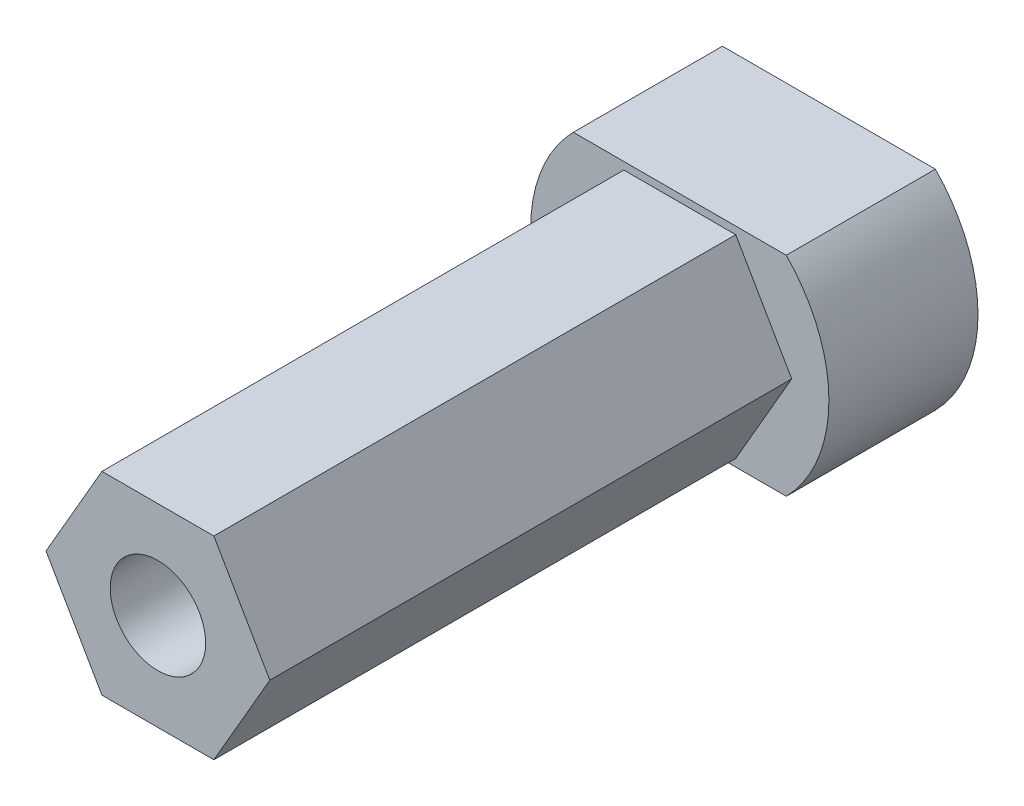
ISO-10303-21;
HEADER;
FILE_DESCRIPTION(('STEP AP214'),'2;1');
FILE_NAME('part.step','',(''),(''),'','','');
FILE_SCHEMA(('AUTOMOTIVE_DESIGN { 1 0 10303 214 1 1 1 1 }'));
ENDSEC;
DATA;
#1=APPLICATION_CONTEXT('core data for automotive mechanical design processes');
#2=APPLICATION_PROTOCOL_DEFINITION('international standard','automotive_design',2000,#1);
#3=PRODUCT_CONTEXT('',#1,'mechanical');
#4=PRODUCT('Part','Part','',(#3));
#5=PRODUCT_RELATED_PRODUCT_CATEGORY('part','',(#4));
#6=PRODUCT_DEFINITION_FORMATION('','',#4);
#7=PRODUCT_DEFINITION_CONTEXT('part definition',#1,'design');
#8=PRODUCT_DEFINITION('design','',#6,#7);
#9=PRODUCT_DEFINITION_SHAPE('','',#8);
#10=(LENGTH_UNIT() NAMED_UNIT(*) SI_UNIT(.MILLI.,.METRE.));
#11=(NAMED_UNIT(*) PLANE_ANGLE_UNIT() SI_UNIT($,.RADIAN.));
#12=(NAMED_UNIT(*) SI_UNIT($,.STERADIAN.) SOLID_ANGLE_UNIT());
#13=UNCERTAINTY_MEASURE_WITH_UNIT(LENGTH_MEASURE(1.E-05),#10,'distance_accuracy_value','');
#14=(GEOMETRIC_REPRESENTATION_CONTEXT(3) GLOBAL_UNCERTAINTY_ASSIGNED_CONTEXT((#13)) GLOBAL_UNIT_ASSIGNED_CONTEXT((#10,
#11,#12)) REPRESENTATION_CONTEXT('',''));
#15=CARTESIAN_POINT('',(0.,0.,0.));
#16=DIRECTION('',(0.,0.,1.));
#17=DIRECTION('',(1.,0.,0.));
#18=AXIS2_PLACEMENT_3D('',#15,#16,#17);
#19=CARTESIAN_POINT('',(0.,0.,0.));
#20=DIRECTION('',(0.,0.,1.));
#21=DIRECTION('',(1.,0.,0.));
#22=AXIS2_PLACEMENT_3D('',#19,#20,#21);
#23=CYLINDRICAL_SURFACE('',#22,1.6);
#24=CARTESIAN_POINT('',(0.,0.,22.5));
#25=DIRECTION('',(0.,0.,1.));
#26=DIRECTION('',(1.,0.,0.));
#27=AXIS2_PLACEMENT_3D('',#24,#25,#26);
#28=CIRCLE('',#27,1.6);
#29=CARTESIAN_POINT('',(1.6,0.,22.5));
#30=VERTEX_POINT('',#29);
#31=EDGE_CURVE('E189',#30,#30,#28,.T.);
#32=CARTESIAN_POINT('',(0.,0.,8.));
#33=DIRECTION('',(0.,0.,-1.));
#34=DIRECTION('',(-1.,0.,0.));
#35=AXIS2_PLACEMENT_3D('',#32,#33,#34);
#36=CIRCLE('',#35,1.6);
#37=CARTESIAN_POINT('',(1.6,0.,8.));
#38=VERTEX_POINT('',#37);
#39=EDGE_CURVE('E165',#38,#38,#36,.F.);
#40=CARTESIAN_POINT('',(1.6,0.,22.5));
#41=CARTESIAN_POINT('',(1.6,0.,22.3489583333333));
#42=CARTESIAN_POINT('',(1.6,0.,22.1979166666667));
#43=CARTESIAN_POINT('',(1.6,0.,21.8958333333333));
#44=CARTESIAN_POINT('',(1.6,0.,21.7447916666667));
#45=CARTESIAN_POINT('',(1.6,0.,21.4427083333333));
#46=CARTESIAN_POINT('',(1.6,0.,21.2916666666667));
#47=CARTESIAN_POINT('',(1.6,0.,20.9895833333333));
#48=CARTESIAN_POINT('',(1.6,0.,20.8385416666667));
#49=CARTESIAN_POINT('',(1.6,0.,20.5364583333333));
#50=CARTESIAN_POINT('',(1.6,0.,20.3854166666667));
#51=CARTESIAN_POINT('',(1.6,0.,20.0833333333333));
#52=CARTESIAN_POINT('',(1.6,0.,19.9322916666667));
#53=CARTESIAN_POINT('',(1.6,0.,19.6302083333333));
#54=CARTESIAN_POINT('',(1.6,0.,19.4791666666667));
#55=CARTESIAN_POINT('',(1.6,0.,19.1770833333333));
#56=CARTESIAN_POINT('',(1.6,0.,19.0260416666667));
#57=CARTESIAN_POINT('',(1.6,0.,18.7239583333333));
#58=CARTESIAN_POINT('',(1.6,0.,18.5729166666667));
#59=CARTESIAN_POINT('',(1.6,0.,18.2708333333333));
#60=CARTESIAN_POINT('',(1.6,0.,18.1197916666667));
#61=CARTESIAN_POINT('',(1.6,0.,17.8177083333333));
#62=CARTESIAN_POINT('',(1.6,0.,17.6666666666667));
#63=CARTESIAN_POINT('',(1.6,0.,17.3645833333333));
#64=CARTESIAN_POINT('',(1.6,0.,17.2135416666667));
#65=CARTESIAN_POINT('',(1.6,0.,16.9114583333333));
#66=CARTESIAN_POINT('',(1.6,0.,16.7604166666667));
#67=CARTESIAN_POINT('',(1.6,0.,16.4583333333333));
#68=CARTESIAN_POINT('',(1.6,0.,16.3072916666667));
#69=CARTESIAN_POINT('',(1.6,0.,16.0052083333333));
#70=CARTESIAN_POINT('',(1.6,0.,15.8541666666667));
#71=CARTESIAN_POINT('',(1.6,0.,15.5520833333333));
#72=CARTESIAN_POINT('',(1.6,0.,15.4010416666667));
#73=CARTESIAN_POINT('',(1.6,0.,15.0989583333333));
#74=CARTESIAN_POINT('',(1.6,0.,14.9479166666667));
#75=CARTESIAN_POINT('',(1.6,0.,14.6458333333333));
#76=CARTESIAN_POINT('',(1.6,0.,14.4947916666667));
#77=CARTESIAN_POINT('',(1.6,0.,14.1927083333333));
#78=CARTESIAN_POINT('',(1.6,0.,14.0416666666667));
#79=CARTESIAN_POINT('',(1.6,0.,13.7395833333333));
#80=CARTESIAN_POINT('',(1.6,0.,13.5885416666667));
#81=CARTESIAN_POINT('',(1.6,0.,13.2864583333333));
#82=CARTESIAN_POINT('',(1.6,0.,13.1354166666667));
#83=CARTESIAN_POINT('',(1.6,0.,12.8333333333333));
#84=CARTESIAN_POINT('',(1.6,0.,12.6822916666667));
#85=CARTESIAN_POINT('',(1.6,0.,12.3802083333333));
#86=CARTESIAN_POINT('',(1.6,0.,12.2291666666667));
#87=CARTESIAN_POINT('',(1.6,0.,11.9270833333333));
#88=CARTESIAN_POINT('',(1.6,0.,11.7760416666667));
#89=CARTESIAN_POINT('',(1.6,0.,11.4739583333333));
#90=CARTESIAN_POINT('',(1.6,0.,11.3229166666667));
#91=CARTESIAN_POINT('',(1.6,0.,11.0208333333333));
#92=CARTESIAN_POINT('',(1.6,0.,10.8697916666667));
#93=CARTESIAN_POINT('',(1.6,0.,10.5677083333333));
#94=CARTESIAN_POINT('',(1.6,0.,10.4166666666667));
#95=CARTESIAN_POINT('',(1.6,0.,10.1145833333333));
#96=CARTESIAN_POINT('',(1.6,0.,9.96354166666667));
#97=CARTESIAN_POINT('',(1.6,0.,9.66145833333333));
#98=CARTESIAN_POINT('',(1.6,0.,9.51041666666667));
#99=CARTESIAN_POINT('',(1.6,0.,9.20833333333334));
#100=CARTESIAN_POINT('',(1.6,0.,9.05729166666667));
#101=CARTESIAN_POINT('',(1.6,0.,8.75520833333334));
#102=CARTESIAN_POINT('',(1.6,0.,8.60416666666667));
#103=CARTESIAN_POINT('',(1.6,0.,8.30208333333334));
#104=CARTESIAN_POINT('',(1.6,0.,8.15104166666667));
#105=CARTESIAN_POINT('',(1.6,0.,8.));
#106=B_SPLINE_CURVE_WITH_KNOTS('',3,(#40,#41,#42,#43,#44,#45,#46,#47,#48,#49,#50,#51,#52,#53,
#54,#55,#56,#57,#58,#59,#60,#61,#62,#63,#64,#65,#66,#67,#68,#69,#70,#71,#72,#73,#74,#75,#76,#77,
#78,#79,#80,#81,#82,#83,#84,#85,#86,#87,#88,#89,#90,#91,#92,#93,#94,#95,#96,#97,#98,#99,#100,
#101,#102,#103,#104,#105),.UNSPECIFIED.,.F.,.F.,(4,2,2,2,2,2,2,2,2,2,2,2,2,2,2,2,2,2,2,2,2,2,2,
2,2,2,2,2,2,2,2,2,4),(0.,0.453124999999999,0.906250000000001,1.359375,1.8125,2.265625,2.71875,
3.171875,3.625,4.078125,4.53125,4.984375,5.4375,5.890625,6.34375,6.796875,7.25,7.703125,8.15625,
8.609375,9.0625,9.515625,9.96875,10.421875,10.875,11.328125,11.78125,12.234375,12.6875,
13.140625,13.59375,14.046875,14.5),.UNSPECIFIED.);
#107=EDGE_CURVE('BSEAM41',#30,#38,#106,.T.);
#108=ORIENTED_EDGE('',*,*,#31,.T.);
#109=ORIENTED_EDGE('',*,*,#39,.F.);
#110=ORIENTED_EDGE('',*,*,#107,.T.);
#111=ORIENTED_EDGE('',*,*,#107,.F.);
#112=EDGE_LOOP('',(#108,#110,#109,#111));
#113=FACE_BOUND('',#112,.T.);
#114=ADVANCED_FACE('F41',(#113),#23,.F.);
#115=CARTESIAN_POINT('',(0.,0.,5.));
#116=DIRECTION('',(0.,0.,-1.));
#117=DIRECTION('',(-1.,0.,0.));
#118=AXIS2_PLACEMENT_3D('',#115,#116,#117);
#119=CYLINDRICAL_SURFACE('',#118,5.);
#120=CARTESIAN_POINT('',(0.,0.,0.));
#121=DIRECTION('',(0.,0.,1.));
#122=DIRECTION('',(1.,0.,0.));
#123=AXIS2_PLACEMENT_3D('',#120,#121,#122);
#124=CIRCLE('',#123,5.);
#125=CARTESIAN_POINT('',(-3.57071421427142,3.5,0.));
#126=VERTEX_POINT('',#125);
#127=CARTESIAN_POINT('',(-3.57071421427142,-3.5,0.));
#128=VERTEX_POINT('',#127);
#129=EDGE_CURVE('E262',#126,#128,#124,.T.);
#130=ORIENTED_EDGE('',*,*,#129,.T.);
#131=DIRECTION('',(0.,0.,-1.));
#132=VECTOR('',#131,1.);
#133=CARTESIAN_POINT('',(-3.57071421427142,-3.5,5.));
#134=LINE('',#133,#132);
#135=CARTESIAN_POINT('',(-3.57071421427142,-3.5,5.));
#136=VERTEX_POINT('',#135);
#137=EDGE_CURVE('E11',#136,#128,#134,.T.);
#138=ORIENTED_EDGE('',*,*,#137,.F.);
#139=CARTESIAN_POINT('',(0.,0.,5.));
#140=DIRECTION('',(0.,0.,1.));
#141=DIRECTION('',(1.,0.,0.));
#142=AXIS2_PLACEMENT_3D('',#139,#140,#141);
#143=CIRCLE('',#142,5.);
#144=CARTESIAN_POINT('',(-3.57071421427142,3.5,5.));
#145=VERTEX_POINT('',#144);
#146=EDGE_CURVE('E263',#145,#136,#143,.T.);
#147=ORIENTED_EDGE('',*,*,#146,.F.);
#148=DIRECTION('',(0.,0.,-1.));
#149=VECTOR('',#148,1.);
#150=CARTESIAN_POINT('',(-3.57071421427142,3.5,5.));
#151=LINE('',#150,#149);
#152=EDGE_CURVE('E276',#145,#126,#151,.T.);
#153=ORIENTED_EDGE('',*,*,#152,.T.);
#154=EDGE_LOOP('',(#130,#138,#147,#153));
#155=FACE_BOUND('',#154,.T.);
#156=ADVANCED_FACE('F315',(#155),#119,.T.);
#157=CARTESIAN_POINT('',(0.,-3.5,5.));
#158=DIRECTION('',(0.,1.,0.));
#159=DIRECTION('',(0.,0.,1.));
#160=AXIS2_PLACEMENT_3D('',#157,#158,#159);
#161=PLANE('',#160);
#162=DIRECTION('',(1.,0.,0.));
#163=VECTOR('',#162,1.);
#164=CARTESIAN_POINT('',(0.,-3.5,0.));
#165=LINE('',#164,#163);
#166=CARTESIAN_POINT('',(3.57071421427142,-3.5,0.));
#167=VERTEX_POINT('',#166);
#168=EDGE_CURVE('E280',#128,#167,#165,.T.);
#169=ORIENTED_EDGE('',*,*,#168,.T.);
#170=DIRECTION('',(0.,0.,-1.));
#171=VECTOR('',#170,1.);
#172=CARTESIAN_POINT('',(3.57071421427142,-3.5,5.));
#173=LINE('',#172,#171);
#174=CARTESIAN_POINT('',(3.57071421427142,-3.5,5.));
#175=VERTEX_POINT('',#174);
#176=EDGE_CURVE('E50',#175,#167,#173,.T.);
#177=ORIENTED_EDGE('',*,*,#176,.F.);
#178=DIRECTION('',(1.,0.,0.));
#179=VECTOR('',#178,1.);
#180=CARTESIAN_POINT('',(0.,-3.5,5.));
#181=LINE('',#180,#179);
#182=EDGE_CURVE('E267',#136,#175,#181,.T.);
#183=ORIENTED_EDGE('',*,*,#182,.F.);
#184=ORIENTED_EDGE('',*,*,#137,.T.);
#185=EDGE_LOOP('',(#169,#177,#183,#184));
#186=FACE_BOUND('',#185,.T.);
#187=ADVANCED_FACE('F43',(#186),#161,.F.);
#188=CARTESIAN_POINT('',(3.57071421427142,3.5,0.));
#189=VERTEX_POINT('',#188);
#190=EDGE_CURVE('E281',#167,#189,#124,.T.);
#191=ORIENTED_EDGE('',*,*,#190,.T.);
#192=DIRECTION('',(0.,0.,-1.));
#193=VECTOR('',#192,1.);
#194=CARTESIAN_POINT('',(3.57071421427142,3.5,5.));
#195=LINE('',#194,#193);
#196=CARTESIAN_POINT('',(3.57071421427142,3.5,5.));
#197=VERTEX_POINT('',#196);
#198=EDGE_CURVE('E289',#197,#189,#195,.T.);
#199=ORIENTED_EDGE('',*,*,#198,.F.);
#200=EDGE_CURVE('E269',#175,#197,#143,.T.);
#201=ORIENTED_EDGE('',*,*,#200,.F.);
#202=ORIENTED_EDGE('',*,*,#176,.T.);
#203=EDGE_LOOP('',(#191,#199,#201,#202));
#204=FACE_BOUND('',#203,.T.);
#205=ADVANCED_FACE('F298',(#204),#119,.T.);
#206=CARTESIAN_POINT('',(0.,3.5,5.));
#207=DIRECTION('',(0.,1.,0.));
#208=DIRECTION('',(0.,0.,1.));
#209=AXIS2_PLACEMENT_3D('',#206,#207,#208);
#210=PLANE('',#209);
#211=DIRECTION('',(1.,0.,0.));
#212=VECTOR('',#211,1.);
#213=CARTESIAN_POINT('',(0.,3.5,0.));
#214=LINE('',#213,#212);
#215=EDGE_CURVE('E268',#126,#189,#214,.T.);
#216=ORIENTED_EDGE('',*,*,#215,.F.);
#217=ORIENTED_EDGE('',*,*,#152,.F.);
#218=DIRECTION('',(1.,0.,0.));
#219=VECTOR('',#218,1.);
#220=CARTESIAN_POINT('',(0.,3.5,5.));
#221=LINE('',#220,#219);
#222=EDGE_CURVE('E272',#145,#197,#221,.T.);
#223=ORIENTED_EDGE('',*,*,#222,.T.);
#224=ORIENTED_EDGE('',*,*,#198,.T.);
#225=EDGE_LOOP('',(#216,#217,#223,#224));
#226=FACE_BOUND('',#225,.T.);
#227=ADVANCED_FACE('F311',(#226),#210,.T.);
#228=CARTESIAN_POINT('',(0.,0.,5.));
#229=DIRECTION('',(0.,0.,1.));
#230=DIRECTION('',(1.,0.,0.));
#231=AXIS2_PLACEMENT_3D('',#228,#229,#230);
#232=PLANE('',#231);
#233=DIRECTION('',(-0.5,0.866025403784438,0.));
#234=VECTOR('',#233,1.);
#235=CARTESIAN_POINT('',(3.75277674973257,0.,5.));
#236=LINE('',#235,#234);
#237=CARTESIAN_POINT('',(3.75277674973257,0.,5.));
#238=VERTEX_POINT('',#237);
#239=CARTESIAN_POINT('',(1.87638837486628,3.25,5.));
#240=VERTEX_POINT('',#239);
#241=EDGE_CURVE('E65',#238,#240,#236,.T.);
#242=ORIENTED_EDGE('',*,*,#241,.F.);
#243=DIRECTION('',(0.5,0.866025403784438,0.));
#244=VECTOR('',#243,1.);
#245=CARTESIAN_POINT('',(1.87638837486628,-3.25,5.));
#246=LINE('',#245,#244);
#247=CARTESIAN_POINT('',(1.87638837486628,-3.25,5.));
#248=VERTEX_POINT('',#247);
#249=EDGE_CURVE('E203',#248,#238,#246,.T.);
#250=ORIENTED_EDGE('',*,*,#249,.F.);
#251=DIRECTION('',(1.,0.,0.));
#252=VECTOR('',#251,1.);
#253=CARTESIAN_POINT('',(-1.87638837486628,-3.25,5.));
#254=LINE('',#253,#252);
#255=CARTESIAN_POINT('',(-1.87638837486628,-3.25,5.));
#256=VERTEX_POINT('',#255);
#257=EDGE_CURVE('E233',#256,#248,#254,.T.);
#258=ORIENTED_EDGE('',*,*,#257,.F.);
#259=DIRECTION('',(0.5,-0.866025403784439,0.));
#260=VECTOR('',#259,1.);
#261=CARTESIAN_POINT('',(-3.75277674973257,0.,5.));
#262=LINE('',#261,#260);
#263=CARTESIAN_POINT('',(-3.75277674973257,0.,5.));
#264=VERTEX_POINT('',#263);
#265=EDGE_CURVE('E229',#264,#256,#262,.T.);
#266=ORIENTED_EDGE('',*,*,#265,.F.);
#267=DIRECTION('',(-0.5,-0.866025403784439,0.));
#268=VECTOR('',#267,1.);
#269=CARTESIAN_POINT('',(-1.87638837486628,3.25,5.));
#270=LINE('',#269,#268);
#271=CARTESIAN_POINT('',(-1.87638837486628,3.25,5.));
#272=VERTEX_POINT('',#271);
#273=EDGE_CURVE('E225',#272,#264,#270,.T.);
#274=ORIENTED_EDGE('',*,*,#273,.F.);
#275=DIRECTION('',(-1.,0.,0.));
#276=VECTOR('',#275,1.);
#277=CARTESIAN_POINT('',(1.87638837486628,3.25,5.));
#278=LINE('',#277,#276);
#279=EDGE_CURVE('E221',#240,#272,#278,.T.);
#280=ORIENTED_EDGE('',*,*,#279,.F.);
#281=EDGE_LOOP('',(#242,#250,#258,#266,#274,#280));
#282=FACE_BOUND('',#281,.T.);
#283=ORIENTED_EDGE('',*,*,#146,.T.);
#284=ORIENTED_EDGE('',*,*,#182,.T.);
#285=ORIENTED_EDGE('',*,*,#200,.T.);
#286=ORIENTED_EDGE('',*,*,#222,.F.);
#287=EDGE_LOOP('',(#283,#284,#285,#286));
#288=FACE_BOUND('',#287,.T.);
#289=ADVANCED_FACE('F309',(#282,#288),#232,.T.);
#290=CARTESIAN_POINT('',(0.,0.,0.));
#291=DIRECTION('',(0.,0.,1.));
#292=DIRECTION('',(1.,0.,0.));
#293=AXIS2_PLACEMENT_3D('',#290,#291,#292);
#294=PLANE('',#293);
#295=DIRECTION('',(-1.,0.,0.));
#296=VECTOR('',#295,1.);
#297=CARTESIAN_POINT('',(0.,-1.875,0.));
#298=LINE('',#297,#296);
#299=CARTESIAN_POINT('',(2.01168461742888,-1.875,0.));
#300=VERTEX_POINT('',#299);
#301=CARTESIAN_POINT('',(-2.01168461742888,-1.875,0.));
#302=VERTEX_POINT('',#301);
#303=EDGE_CURVE('E179',#300,#302,#298,.T.);
#304=ORIENTED_EDGE('',*,*,#303,.F.);
#305=CARTESIAN_POINT('',(0.,0.,0.));
#306=DIRECTION('',(0.,0.,-1.));
#307=DIRECTION('',(-1.,0.,0.));
#308=AXIS2_PLACEMENT_3D('',#305,#306,#307);
#309=CIRCLE('',#308,2.75);
#310=CARTESIAN_POINT('',(2.01168461742888,1.875,0.));
#311=VERTEX_POINT('',#310);
#312=EDGE_CURVE('E57',#311,#300,#309,.T.);
#313=ORIENTED_EDGE('',*,*,#312,.F.);
#314=DIRECTION('',(-1.,0.,0.));
#315=VECTOR('',#314,1.);
#316=CARTESIAN_POINT('',(0.,1.875,0.));
#317=LINE('',#316,#315);
#318=CARTESIAN_POINT('',(-2.01168461742888,1.875,0.));
#319=VERTEX_POINT('',#318);
#320=EDGE_CURVE('E169',#311,#319,#317,.T.);
#321=ORIENTED_EDGE('',*,*,#320,.T.);
#322=EDGE_CURVE('E180',#302,#319,#309,.T.);
#323=ORIENTED_EDGE('',*,*,#322,.F.);
#324=EDGE_LOOP('',(#304,#313,#321,#323));
#325=FACE_BOUND('',#324,.T.);
#326=ORIENTED_EDGE('',*,*,#129,.F.);
#327=ORIENTED_EDGE('',*,*,#215,.T.);
#328=ORIENTED_EDGE('',*,*,#190,.F.);
#329=ORIENTED_EDGE('',*,*,#168,.F.);
#330=EDGE_LOOP('',(#326,#327,#328,#329));
#331=FACE_BOUND('',#330,.T.);
#332=ADVANCED_FACE('F303',(#325,#331),#294,.F.);
#333=CARTESIAN_POINT('',(3.75277674973257,0.,22.5));
#334=DIRECTION('',(-0.866025403784439,-0.5,0.));
#335=DIRECTION('',(0.5,-0.866025403784439,0.));
#336=AXIS2_PLACEMENT_3D('',#333,#334,#335);
#337=PLANE('',#336);
#338=ORIENTED_EDGE('',*,*,#241,.T.);
#339=DIRECTION('',(0.,0.,-1.));
#340=VECTOR('',#339,1.);
#341=CARTESIAN_POINT('',(1.87638837486628,3.25,22.5));
#342=LINE('',#341,#340);
#343=CARTESIAN_POINT('',(1.87638837486628,3.25,22.5));
#344=VERTEX_POINT('',#343);
#345=EDGE_CURVE('E258',#344,#240,#342,.T.);
#346=ORIENTED_EDGE('',*,*,#345,.F.);
#347=DIRECTION('',(-0.5,0.866025403784438,0.));
#348=VECTOR('',#347,1.);
#349=CARTESIAN_POINT('',(3.75277674973257,0.,22.5));
#350=LINE('',#349,#348);
#351=CARTESIAN_POINT('',(3.75277674973257,0.,22.5));
#352=VERTEX_POINT('',#351);
#353=EDGE_CURVE('E198',#352,#344,#350,.T.);
#354=ORIENTED_EDGE('',*,*,#353,.F.);
#355=DIRECTION('',(0.,0.,-1.));
#356=VECTOR('',#355,1.);
#357=CARTESIAN_POINT('',(3.75277674973257,0.,22.5));
#358=LINE('',#357,#356);
#359=EDGE_CURVE('E218',#352,#238,#358,.T.);
#360=ORIENTED_EDGE('',*,*,#359,.T.);
#361=EDGE_LOOP('',(#338,#346,#354,#360));
#362=FACE_BOUND('',#361,.T.);
#363=ADVANCED_FACE('F353',(#362),#337,.F.);
#364=CARTESIAN_POINT('',(1.87638837486628,3.25,22.5));
#365=DIRECTION('',(0.,-1.,0.));
#366=DIRECTION('',(1.,0.,0.));
#367=AXIS2_PLACEMENT_3D('',#364,#365,#366);
#368=PLANE('',#367);
#369=ORIENTED_EDGE('',*,*,#279,.T.);
#370=DIRECTION('',(0.,0.,-1.));
#371=VECTOR('',#370,1.);
#372=CARTESIAN_POINT('',(-1.87638837486628,3.25,22.5));
#373=LINE('',#372,#371);
#374=CARTESIAN_POINT('',(-1.87638837486628,3.25,22.5));
#375=VERTEX_POINT('',#374);
#376=EDGE_CURVE('E254',#375,#272,#373,.T.);
#377=ORIENTED_EDGE('',*,*,#376,.F.);
#378=DIRECTION('',(-1.,0.,0.));
#379=VECTOR('',#378,1.);
#380=CARTESIAN_POINT('',(1.87638837486628,3.25,22.5));
#381=LINE('',#380,#379);
#382=EDGE_CURVE('E202',#344,#375,#381,.T.);
#383=ORIENTED_EDGE('',*,*,#382,.F.);
#384=ORIENTED_EDGE('',*,*,#345,.T.);
#385=EDGE_LOOP('',(#369,#377,#383,#384));
#386=FACE_BOUND('',#385,.T.);
#387=ADVANCED_FACE('F349',(#386),#368,.F.);
#388=CARTESIAN_POINT('',(-1.87638837486628,3.25,22.5));
#389=DIRECTION('',(0.866025403784439,-0.5,0.));
#390=DIRECTION('',(0.5,0.866025403784439,0.));
#391=AXIS2_PLACEMENT_3D('',#388,#389,#390);
#392=PLANE('',#391);
#393=ORIENTED_EDGE('',*,*,#273,.T.);
#394=DIRECTION('',(0.,0.,-1.));
#395=VECTOR('',#394,1.);
#396=CARTESIAN_POINT('',(-3.75277674973257,0.,22.5));
#397=LINE('',#396,#395);
#398=CARTESIAN_POINT('',(-3.75277674973257,0.,22.5));
#399=VERTEX_POINT('',#398);
#400=EDGE_CURVE('E250',#399,#264,#397,.T.);
#401=ORIENTED_EDGE('',*,*,#400,.F.);
#402=DIRECTION('',(-0.5,-0.866025403784439,0.));
#403=VECTOR('',#402,1.);
#404=CARTESIAN_POINT('',(-1.87638837486628,3.25,22.5));
#405=LINE('',#404,#403);
#406=EDGE_CURVE('E206',#375,#399,#405,.T.);
#407=ORIENTED_EDGE('',*,*,#406,.F.);
#408=ORIENTED_EDGE('',*,*,#376,.T.);
#409=EDGE_LOOP('',(#393,#401,#407,#408));
#410=FACE_BOUND('',#409,.T.);
#411=ADVANCED_FACE('F345',(#410),#392,.F.);
#412=CARTESIAN_POINT('',(-3.75277674973257,0.,22.5));
#413=DIRECTION('',(0.866025403784439,0.5,0.));
#414=DIRECTION('',(-0.5,0.866025403784439,0.));
#415=AXIS2_PLACEMENT_3D('',#412,#413,#414);
#416=PLANE('',#415);
#417=ORIENTED_EDGE('',*,*,#265,.T.);
#418=DIRECTION('',(0.,0.,-1.));
#419=VECTOR('',#418,1.);
#420=CARTESIAN_POINT('',(-1.87638837486628,-3.25,22.5));
#421=LINE('',#420,#419);
#422=CARTESIAN_POINT('',(-1.87638837486628,-3.25,22.5));
#423=VERTEX_POINT('',#422);
#424=EDGE_CURVE('E246',#423,#256,#421,.T.);
#425=ORIENTED_EDGE('',*,*,#424,.F.);
#426=DIRECTION('',(0.5,-0.866025403784439,0.));
#427=VECTOR('',#426,1.);
#428=CARTESIAN_POINT('',(-3.75277674973257,0.,22.5));
#429=LINE('',#428,#427);
#430=EDGE_CURVE('E209',#399,#423,#429,.T.);
#431=ORIENTED_EDGE('',*,*,#430,.F.);
#432=ORIENTED_EDGE('',*,*,#400,.T.);
#433=EDGE_LOOP('',(#417,#425,#431,#432));
#434=FACE_BOUND('',#433,.T.);
#435=ADVANCED_FACE('F341',(#434),#416,.F.);
#436=CARTESIAN_POINT('',(-1.87638837486628,-3.25,22.5));
#437=DIRECTION('',(0.,1.,0.));
#438=DIRECTION('',(0.,0.,1.));
#439=AXIS2_PLACEMENT_3D('',#436,#437,#438);
#440=PLANE('',#439);
#441=ORIENTED_EDGE('',*,*,#257,.T.);
#442=DIRECTION('',(0.,0.,-1.));
#443=VECTOR('',#442,1.);
#444=CARTESIAN_POINT('',(1.87638837486628,-3.25,22.5));
#445=LINE('',#444,#443);
#446=CARTESIAN_POINT('',(1.87638837486628,-3.25,22.5));
#447=VERTEX_POINT('',#446);
#448=EDGE_CURVE('E242',#447,#248,#445,.T.);
#449=ORIENTED_EDGE('',*,*,#448,.F.);
#450=DIRECTION('',(1.,0.,0.));
#451=VECTOR('',#450,1.);
#452=CARTESIAN_POINT('',(-1.87638837486628,-3.25,22.5));
#453=LINE('',#452,#451);
#454=EDGE_CURVE('E212',#423,#447,#453,.T.);
#455=ORIENTED_EDGE('',*,*,#454,.F.);
#456=ORIENTED_EDGE('',*,*,#424,.T.);
#457=EDGE_LOOP('',(#441,#449,#455,#456));
#458=FACE_BOUND('',#457,.T.);
#459=ADVANCED_FACE('F337',(#458),#440,.F.);
#460=CARTESIAN_POINT('',(1.87638837486628,-3.25,22.5));
#461=DIRECTION('',(-0.866025403784439,0.5,0.));
#462=DIRECTION('',(-0.5,-0.866025403784439,0.));
#463=AXIS2_PLACEMENT_3D('',#460,#461,#462);
#464=PLANE('',#463);
#465=ORIENTED_EDGE('',*,*,#249,.T.);
#466=ORIENTED_EDGE('',*,*,#359,.F.);
#467=DIRECTION('',(0.5,0.866025403784438,0.));
#468=VECTOR('',#467,1.);
#469=CARTESIAN_POINT('',(1.87638837486628,-3.25,22.5));
#470=LINE('',#469,#468);
#471=EDGE_CURVE('E215',#447,#352,#470,.T.);
#472=ORIENTED_EDGE('',*,*,#471,.F.);
#473=ORIENTED_EDGE('',*,*,#448,.T.);
#474=EDGE_LOOP('',(#465,#466,#472,#473));
#475=FACE_BOUND('',#474,.T.);
#476=ADVANCED_FACE('F333',(#475),#464,.F.);
#477=CARTESIAN_POINT('',(0.,0.,22.5));
#478=DIRECTION('',(0.,0.,1.));
#479=DIRECTION('',(1.,0.,0.));
#480=AXIS2_PLACEMENT_3D('',#477,#478,#479);
#481=PLANE('',#480);
#482=ORIENTED_EDGE('',*,*,#31,.F.);
#483=EDGE_LOOP('',(#482));
#484=FACE_BOUND('',#483,.T.);
#485=ORIENTED_EDGE('',*,*,#353,.T.);
#486=ORIENTED_EDGE('',*,*,#382,.T.);
#487=ORIENTED_EDGE('',*,*,#406,.T.);
#488=ORIENTED_EDGE('',*,*,#430,.T.);
#489=ORIENTED_EDGE('',*,*,#454,.T.);
#490=ORIENTED_EDGE('',*,*,#471,.T.);
#491=EDGE_LOOP('',(#485,#486,#487,#488,#489,#490));
#492=FACE_BOUND('',#491,.T.);
#493=ADVANCED_FACE('F330',(#484,#492),#481,.T.);
#494=CARTESIAN_POINT('',(0.,0.,8.));
#495=DIRECTION('',(0.,0.,-1.));
#496=DIRECTION('',(-1.,0.,0.));
#497=AXIS2_PLACEMENT_3D('',#494,#495,#496);
#498=CYLINDRICAL_SURFACE('',#497,2.75);
#499=ORIENTED_EDGE('',*,*,#312,.T.);
#500=DIRECTION('',(0.,0.,-1.));
#501=VECTOR('',#500,1.);
#502=CARTESIAN_POINT('',(2.01168461742888,-1.875,8.));
#503=LINE('',#502,#501);
#504=CARTESIAN_POINT('',(2.01168461742888,-1.875,8.));
#505=VERTEX_POINT('',#504);
#506=EDGE_CURVE('E141',#505,#300,#503,.T.);
#507=ORIENTED_EDGE('',*,*,#506,.F.);
#508=CARTESIAN_POINT('',(0.,0.,8.));
#509=DIRECTION('',(0.,0.,-1.));
#510=DIRECTION('',(-1.,0.,0.));
#511=AXIS2_PLACEMENT_3D('',#508,#509,#510);
#512=CIRCLE('',#511,2.75);
#513=CARTESIAN_POINT('',(2.01168461742888,1.875,8.));
#514=VERTEX_POINT('',#513);
#515=EDGE_CURVE('E145',#514,#505,#512,.T.);
#516=ORIENTED_EDGE('',*,*,#515,.F.);
#517=DIRECTION('',(0.,0.,-1.));
#518=VECTOR('',#517,1.);
#519=CARTESIAN_POINT('',(2.01168461742888,1.875,8.));
#520=LINE('',#519,#518);
#521=EDGE_CURVE('E186',#514,#311,#520,.T.);
#522=ORIENTED_EDGE('',*,*,#521,.T.);
#523=EDGE_LOOP('',(#499,#507,#516,#522));
#524=FACE_BOUND('',#523,.T.);
#525=ADVANCED_FACE('F143',(#524),#498,.F.);
#526=CARTESIAN_POINT('',(0.,1.875,8.));
#527=DIRECTION('',(0.,-1.,0.));
#528=DIRECTION('',(0.,0.,-1.));
#529=AXIS2_PLACEMENT_3D('',#526,#527,#528);
#530=PLANE('',#529);
#531=ORIENTED_EDGE('',*,*,#320,.F.);
#532=ORIENTED_EDGE('',*,*,#521,.F.);
#533=DIRECTION('',(-1.,0.,0.));
#534=VECTOR('',#533,1.);
#535=CARTESIAN_POINT('',(0.,1.875,8.));
#536=LINE('',#535,#534);
#537=CARTESIAN_POINT('',(-2.01168461742888,1.875,8.));
#538=VERTEX_POINT('',#537);
#539=EDGE_CURVE('E151',#514,#538,#536,.T.);
#540=ORIENTED_EDGE('',*,*,#539,.T.);
#541=DIRECTION('',(0.,0.,-1.));
#542=VECTOR('',#541,1.);
#543=CARTESIAN_POINT('',(-2.01168461742888,1.875,8.));
#544=LINE('',#543,#542);
#545=EDGE_CURVE('E190',#538,#319,#544,.T.);
#546=ORIENTED_EDGE('',*,*,#545,.T.);
#547=EDGE_LOOP('',(#531,#532,#540,#546));
#548=FACE_BOUND('',#547,.T.);
#549=ADVANCED_FACE('F410',(#548),#530,.T.);
#550=ORIENTED_EDGE('',*,*,#322,.T.);
#551=ORIENTED_EDGE('',*,*,#545,.F.);
#552=CARTESIAN_POINT('',(-2.01168461742888,-1.875,8.));
#553=VERTEX_POINT('',#552);
#554=EDGE_CURVE('E160',#553,#538,#512,.T.);
#555=ORIENTED_EDGE('',*,*,#554,.F.);
#556=DIRECTION('',(0.,0.,-1.));
#557=VECTOR('',#556,1.);
#558=CARTESIAN_POINT('',(-2.01168461742888,-1.875,8.));
#559=LINE('',#558,#557);
#560=EDGE_CURVE('E150',#553,#302,#559,.T.);
#561=ORIENTED_EDGE('',*,*,#560,.T.);
#562=EDGE_LOOP('',(#550,#551,#555,#561));
#563=FACE_BOUND('',#562,.T.);
#564=ADVANCED_FACE('F411',(#563),#498,.F.);
#565=CARTESIAN_POINT('',(0.,-1.875,8.));
#566=DIRECTION('',(0.,-1.,0.));
#567=DIRECTION('',(0.,0.,-1.));
#568=AXIS2_PLACEMENT_3D('',#565,#566,#567);
#569=PLANE('',#568);
#570=ORIENTED_EDGE('',*,*,#303,.T.);
#571=ORIENTED_EDGE('',*,*,#560,.F.);
#572=DIRECTION('',(-1.,0.,0.));
#573=VECTOR('',#572,1.);
#574=CARTESIAN_POINT('',(0.,-1.875,8.));
#575=LINE('',#574,#573);
#576=EDGE_CURVE('E154',#505,#553,#575,.T.);
#577=ORIENTED_EDGE('',*,*,#576,.F.);
#578=ORIENTED_EDGE('',*,*,#506,.T.);
#579=EDGE_LOOP('',(#570,#571,#577,#578));
#580=FACE_BOUND('',#579,.T.);
#581=ADVANCED_FACE('F155',(#580),#569,.F.);
#582=CARTESIAN_POINT('',(0.,0.,8.));
#583=DIRECTION('',(0.,0.,-1.));
#584=DIRECTION('',(-1.,0.,0.));
#585=AXIS2_PLACEMENT_3D('',#582,#583,#584);
#586=PLANE('',#585);
#587=ORIENTED_EDGE('',*,*,#39,.T.);
#588=EDGE_LOOP('',(#587));
#589=FACE_BOUND('',#588,.T.);
#590=ORIENTED_EDGE('',*,*,#515,.T.);
#591=ORIENTED_EDGE('',*,*,#576,.T.);
#592=ORIENTED_EDGE('',*,*,#554,.T.);
#593=ORIENTED_EDGE('',*,*,#539,.F.);
#594=EDGE_LOOP('',(#590,#591,#592,#593));
#595=FACE_BOUND('',#594,.T.);
#596=ADVANCED_FACE('F163',(#589,#595),#586,.T.);
#597=CLOSED_SHELL('',(#114,#156,#187,#205,#227,#289,#332,#363,#387,#411,#435,#459,#476,#493,
#525,#549,#564,#581,#596));
#598=MANIFOLD_SOLID_BREP('B2',#597);
#599=ADVANCED_BREP_SHAPE_REPRESENTATION('',(#18,#598),#14);
#600=SHAPE_DEFINITION_REPRESENTATION(#9,#599);
ENDSEC;
END-ISO-10303-21;
